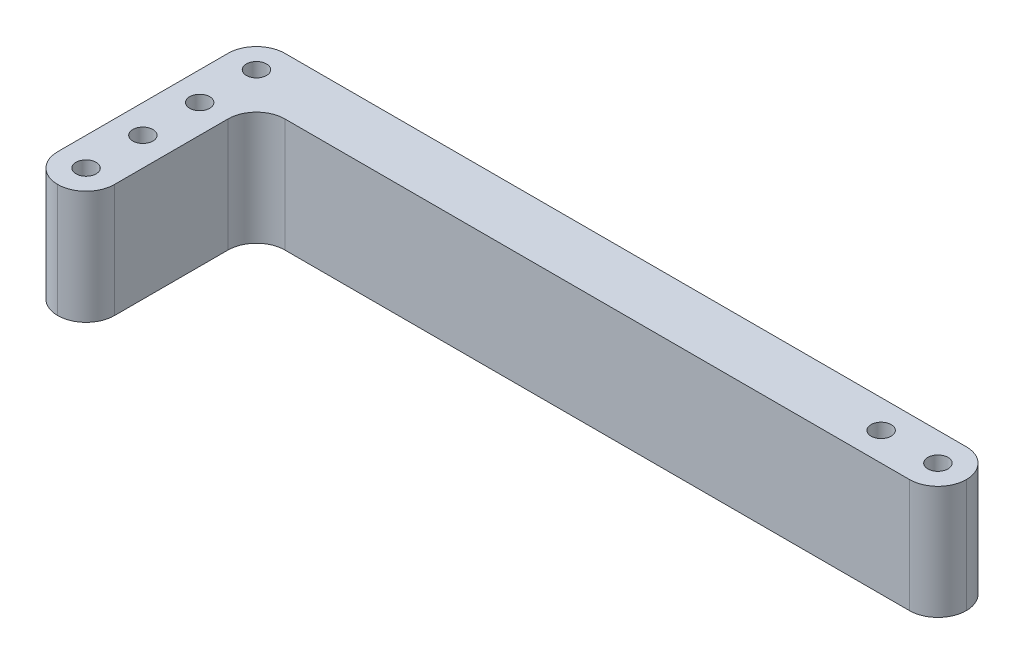
ISO-10303-21;
HEADER;
FILE_DESCRIPTION(('STEP AP214'),'2;1');
FILE_NAME('part.step','',(''),(''),'','','');
FILE_SCHEMA(('AUTOMOTIVE_DESIGN { 1 0 10303 214 1 1 1 1 }'));
ENDSEC;
DATA;
#1=APPLICATION_CONTEXT('core data for automotive mechanical design processes');
#2=APPLICATION_PROTOCOL_DEFINITION('international standard','automotive_design',2000,#1);
#3=PRODUCT_CONTEXT('',#1,'mechanical');
#4=PRODUCT('Part','Part','',(#3));
#5=PRODUCT_RELATED_PRODUCT_CATEGORY('part','',(#4));
#6=PRODUCT_DEFINITION_FORMATION('','',#4);
#7=PRODUCT_DEFINITION_CONTEXT('part definition',#1,'design');
#8=PRODUCT_DEFINITION('design','',#6,#7);
#9=PRODUCT_DEFINITION_SHAPE('','',#8);
#10=(LENGTH_UNIT() NAMED_UNIT(*) SI_UNIT(.MILLI.,.METRE.));
#11=(NAMED_UNIT(*) PLANE_ANGLE_UNIT() SI_UNIT($,.RADIAN.));
#12=(NAMED_UNIT(*) SI_UNIT($,.STERADIAN.) SOLID_ANGLE_UNIT());
#13=UNCERTAINTY_MEASURE_WITH_UNIT(LENGTH_MEASURE(1.E-05),#10,'distance_accuracy_value','');
#14=(GEOMETRIC_REPRESENTATION_CONTEXT(3) GLOBAL_UNCERTAINTY_ASSIGNED_CONTEXT((#13)) GLOBAL_UNIT_ASSIGNED_CONTEXT((#10,
#11,#12)) REPRESENTATION_CONTEXT('',''));
#15=CARTESIAN_POINT('',(0.,0.,0.));
#16=DIRECTION('',(0.,0.,1.));
#17=DIRECTION('',(1.,0.,0.));
#18=AXIS2_PLACEMENT_3D('',#15,#16,#17);
#19=CARTESIAN_POINT('',(0.,25.4,0.));
#20=DIRECTION('',(0.,-1.,0.));
#21=DIRECTION('',(0.,0.,-1.));
#22=AXIS2_PLACEMENT_3D('',#19,#20,#21);
#23=PLANE('',#22);
#24=DIRECTION('',(-1.,0.,0.));
#25=VECTOR('',#24,1.);
#26=CARTESIAN_POINT('',(-19.05,25.4,-44.45));
#27=LINE('',#26,#25);
#28=CARTESIAN_POINT('',(152.4,25.4,-44.45));
#29=VERTEX_POINT('',#28);
#30=CARTESIAN_POINT('',(0.,25.4,-44.45));
#31=VERTEX_POINT('',#30);
#32=EDGE_CURVE('E185',#29,#31,#27,.T.);
#33=ORIENTED_EDGE('',*,*,#32,.T.);
#34=CARTESIAN_POINT('',(0.,25.4,-38.1));
#35=DIRECTION('',(0.,-1.,0.));
#36=DIRECTION('',(0.,0.,-1.));
#37=AXIS2_PLACEMENT_3D('',#34,#35,#36);
#38=CIRCLE('',#37,6.35);
#39=CARTESIAN_POINT('',(-6.35,25.4,-38.1));
#40=VERTEX_POINT('',#39);
#41=EDGE_CURVE('E225',#31,#40,#38,.F.);
#42=ORIENTED_EDGE('',*,*,#41,.T.);
#43=DIRECTION('',(0.,0.,1.));
#44=VECTOR('',#43,1.);
#45=CARTESIAN_POINT('',(-6.35,25.4,6.35));
#46=LINE('',#45,#44);
#47=CARTESIAN_POINT('',(-6.35,25.4,0.));
#48=VERTEX_POINT('',#47);
#49=EDGE_CURVE('E431',#40,#48,#46,.T.);
#50=ORIENTED_EDGE('',*,*,#49,.T.);
#51=CARTESIAN_POINT('',(0.,25.4,0.));
#52=DIRECTION('',(0.,-1.,0.));
#53=DIRECTION('',(0.,0.,-1.));
#54=AXIS2_PLACEMENT_3D('',#51,#52,#53);
#55=CIRCLE('',#54,6.35);
#56=CARTESIAN_POINT('',(0.,25.4,6.35));
#57=VERTEX_POINT('',#56);
#58=EDGE_CURVE('E213',#48,#57,#55,.F.);
#59=ORIENTED_EDGE('',*,*,#58,.T.);
#60=CARTESIAN_POINT('',(0.,25.4,0.));
#61=DIRECTION('',(0.,-1.,0.));
#62=DIRECTION('',(0.,0.,-1.));
#63=AXIS2_PLACEMENT_3D('',#60,#61,#62);
#64=CIRCLE('',#63,6.35);
#65=CARTESIAN_POINT('',(6.35,25.4,0.));
#66=VERTEX_POINT('',#65);
#67=EDGE_CURVE('E216',#57,#66,#64,.F.);
#68=ORIENTED_EDGE('',*,*,#67,.T.);
#69=DIRECTION('',(0.,0.,-1.));
#70=VECTOR('',#69,1.);
#71=CARTESIAN_POINT('',(6.34999999999999,25.4,-31.75));
#72=LINE('',#71,#70);
#73=CARTESIAN_POINT('',(6.35,25.4,-25.4));
#74=VERTEX_POINT('',#73);
#75=EDGE_CURVE('E435',#66,#74,#72,.T.);
#76=ORIENTED_EDGE('',*,*,#75,.T.);
#77=CARTESIAN_POINT('',(12.7,25.4,-25.4));
#78=DIRECTION('',(0.,-1.,0.));
#79=DIRECTION('',(0.,0.,-1.));
#80=AXIS2_PLACEMENT_3D('',#77,#78,#79);
#81=CIRCLE('',#80,6.35);
#82=CARTESIAN_POINT('',(12.7,25.4,-31.75));
#83=VERTEX_POINT('',#82);
#84=EDGE_CURVE('E261',#74,#83,#81,.T.);
#85=ORIENTED_EDGE('',*,*,#84,.T.);
#86=DIRECTION('',(1.,0.,0.));
#87=VECTOR('',#86,1.);
#88=CARTESIAN_POINT('',(158.75,25.4,-31.75));
#89=LINE('',#88,#87);
#90=CARTESIAN_POINT('',(152.4,25.4,-31.75));
#91=VERTEX_POINT('',#90);
#92=EDGE_CURVE('E167',#83,#91,#89,.T.);
#93=ORIENTED_EDGE('',*,*,#92,.T.);
#94=CARTESIAN_POINT('',(152.4,25.4,-38.1));
#95=DIRECTION('',(0.,-1.,0.));
#96=DIRECTION('',(0.,0.,-1.));
#97=AXIS2_PLACEMENT_3D('',#94,#95,#96);
#98=CIRCLE('',#97,6.35);
#99=CARTESIAN_POINT('',(158.75,25.4,-38.1));
#100=VERTEX_POINT('',#99);
#101=EDGE_CURVE('E219',#91,#100,#98,.F.);
#102=ORIENTED_EDGE('',*,*,#101,.T.);
#103=CARTESIAN_POINT('',(152.4,25.4,-38.1));
#104=DIRECTION('',(0.,-1.,0.));
#105=DIRECTION('',(0.,0.,-1.));
#106=AXIS2_PLACEMENT_3D('',#103,#104,#105);
#107=CIRCLE('',#106,6.35);
#108=EDGE_CURVE('E222',#100,#29,#107,.F.);
#109=ORIENTED_EDGE('',*,*,#108,.T.);
#110=EDGE_LOOP('',(#33,#42,#50,#59,#68,#76,#85,#93,#102,#109));
#111=FACE_BOUND('',#110,.T.);
#112=CARTESIAN_POINT('',(0.,25.4,-38.1));
#113=DIRECTION('',(0.,1.,0.));
#114=DIRECTION('',(0.,0.,1.));
#115=AXIS2_PLACEMENT_3D('',#112,#113,#114);
#116=CIRCLE('',#115,2.25);
#117=CARTESIAN_POINT('',(0.,25.4,-35.85));
#118=VERTEX_POINT('',#117);
#119=EDGE_CURVE('E422',#118,#118,#116,.T.);
#120=ORIENTED_EDGE('',*,*,#119,.F.);
#121=EDGE_LOOP('',(#120));
#122=FACE_BOUND('',#121,.T.);
#123=CARTESIAN_POINT('',(152.4,25.4,-38.1));
#124=DIRECTION('',(0.,1.,0.));
#125=DIRECTION('',(0.,0.,1.));
#126=AXIS2_PLACEMENT_3D('',#123,#124,#125);
#127=CIRCLE('',#126,2.25000000000001);
#128=CARTESIAN_POINT('',(152.4,25.4,-35.85));
#129=VERTEX_POINT('',#128);
#130=EDGE_CURVE('E414',#129,#129,#127,.T.);
#131=ORIENTED_EDGE('',*,*,#130,.F.);
#132=EDGE_LOOP('',(#131));
#133=FACE_BOUND('',#132,.T.);
#134=CARTESIAN_POINT('',(139.7,25.4,-38.1));
#135=DIRECTION('',(0.,1.,0.));
#136=DIRECTION('',(0.,0.,1.));
#137=AXIS2_PLACEMENT_3D('',#134,#135,#136);
#138=CIRCLE('',#137,2.25000000000001);
#139=CARTESIAN_POINT('',(139.7,25.4,-35.85));
#140=VERTEX_POINT('',#139);
#141=EDGE_CURVE('E406',#140,#140,#138,.T.);
#142=ORIENTED_EDGE('',*,*,#141,.F.);
#143=EDGE_LOOP('',(#142));
#144=FACE_BOUND('',#143,.T.);
#145=CARTESIAN_POINT('',(1.32247788292465E-13,25.4,-25.4));
#146=DIRECTION('',(0.,1.,0.));
#147=DIRECTION('',(0.,0.,1.));
#148=AXIS2_PLACEMENT_3D('',#145,#146,#147);
#149=CIRCLE('',#148,2.25);
#150=CARTESIAN_POINT('',(1.32247788292465E-13,25.4,-23.15));
#151=VERTEX_POINT('',#150);
#152=EDGE_CURVE('E398',#151,#151,#149,.T.);
#153=ORIENTED_EDGE('',*,*,#152,.F.);
#154=EDGE_LOOP('',(#153));
#155=FACE_BOUND('',#154,.T.);
#156=CARTESIAN_POINT('',(2.6449557658493E-13,25.4,-12.7));
#157=DIRECTION('',(0.,1.,0.));
#158=DIRECTION('',(0.,0.,1.));
#159=AXIS2_PLACEMENT_3D('',#156,#157,#158);
#160=CIRCLE('',#159,2.25);
#161=CARTESIAN_POINT('',(2.6449557658493E-13,25.4,-10.45));
#162=VERTEX_POINT('',#161);
#163=EDGE_CURVE('E390',#162,#162,#160,.T.);
#164=ORIENTED_EDGE('',*,*,#163,.F.);
#165=EDGE_LOOP('',(#164));
#166=FACE_BOUND('',#165,.T.);
#167=CARTESIAN_POINT('',(3.96743364877394E-13,25.4,0.));
#168=DIRECTION('',(0.,1.,0.));
#169=DIRECTION('',(0.,0.,1.));
#170=AXIS2_PLACEMENT_3D('',#167,#168,#169);
#171=CIRCLE('',#170,2.25);
#172=CARTESIAN_POINT('',(3.96743364877394E-13,25.4,2.24999999999999));
#173=VERTEX_POINT('',#172);
#174=EDGE_CURVE('E382',#173,#173,#171,.T.);
#175=ORIENTED_EDGE('',*,*,#174,.F.);
#176=EDGE_LOOP('',(#175));
#177=FACE_BOUND('',#176,.T.);
#178=ADVANCED_FACE('F41',(#111,#122,#133,#144,#155,#166,#177),#23,.F.);
#179=CARTESIAN_POINT('',(0.,0.,0.));
#180=DIRECTION('',(0.,-1.,0.));
#181=DIRECTION('',(0.,0.,-1.));
#182=AXIS2_PLACEMENT_3D('',#179,#180,#181);
#183=PLANE('',#182);
#184=CARTESIAN_POINT('',(2.6449557658493E-13,0.,-12.7));
#185=DIRECTION('',(0.,1.,0.));
#186=DIRECTION('',(0.,0.,1.));
#187=AXIS2_PLACEMENT_3D('',#184,#185,#186);
#188=CIRCLE('',#187,2.25);
#189=CARTESIAN_POINT('',(2.6449557658493E-13,0.,-10.45));
#190=VERTEX_POINT('',#189);
#191=EDGE_CURVE('E386',#190,#190,#188,.T.);
#192=ORIENTED_EDGE('',*,*,#191,.T.);
#193=EDGE_LOOP('',(#192));
#194=FACE_BOUND('',#193,.T.);
#195=CARTESIAN_POINT('',(139.7,0.,-38.1));
#196=DIRECTION('',(0.,1.,0.));
#197=DIRECTION('',(0.,0.,1.));
#198=AXIS2_PLACEMENT_3D('',#195,#196,#197);
#199=CIRCLE('',#198,2.25000000000001);
#200=CARTESIAN_POINT('',(139.7,0.,-35.85));
#201=VERTEX_POINT('',#200);
#202=EDGE_CURVE('E402',#201,#201,#199,.T.);
#203=ORIENTED_EDGE('',*,*,#202,.T.);
#204=EDGE_LOOP('',(#203));
#205=FACE_BOUND('',#204,.T.);
#206=CARTESIAN_POINT('',(0.,0.,-38.1));
#207=DIRECTION('',(0.,1.,0.));
#208=DIRECTION('',(0.,0.,1.));
#209=AXIS2_PLACEMENT_3D('',#206,#207,#208);
#210=CIRCLE('',#209,2.25);
#211=CARTESIAN_POINT('',(0.,0.,-35.85));
#212=VERTEX_POINT('',#211);
#213=EDGE_CURVE('E418',#212,#212,#210,.T.);
#214=ORIENTED_EDGE('',*,*,#213,.T.);
#215=EDGE_LOOP('',(#214));
#216=FACE_BOUND('',#215,.T.);
#217=DIRECTION('',(-1.,0.,0.));
#218=VECTOR('',#217,1.);
#219=CARTESIAN_POINT('',(-19.05,0.,-44.45));
#220=LINE('',#219,#218);
#221=CARTESIAN_POINT('',(152.4,0.,-44.45));
#222=VERTEX_POINT('',#221);
#223=CARTESIAN_POINT('',(-12.7,0.,-44.45));
#224=VERTEX_POINT('',#223);
#225=EDGE_CURVE('E155',#222,#224,#220,.T.);
#226=ORIENTED_EDGE('',*,*,#225,.F.);
#227=CARTESIAN_POINT('',(152.4,0.,-38.1));
#228=DIRECTION('',(0.,-1.,0.));
#229=DIRECTION('',(0.,0.,-1.));
#230=AXIS2_PLACEMENT_3D('',#227,#228,#229);
#231=CIRCLE('',#230,6.35);
#232=CARTESIAN_POINT('',(158.75,0.,-38.1));
#233=VERTEX_POINT('',#232);
#234=EDGE_CURVE('E255',#222,#233,#231,.T.);
#235=ORIENTED_EDGE('',*,*,#234,.T.);
#236=CARTESIAN_POINT('',(152.4,0.,-38.1));
#237=DIRECTION('',(0.,-1.,0.));
#238=DIRECTION('',(0.,0.,-1.));
#239=AXIS2_PLACEMENT_3D('',#236,#237,#238);
#240=CIRCLE('',#239,6.35);
#241=CARTESIAN_POINT('',(152.4,0.,-31.75));
#242=VERTEX_POINT('',#241);
#243=EDGE_CURVE('E252',#233,#242,#240,.T.);
#244=ORIENTED_EDGE('',*,*,#243,.T.);
#245=DIRECTION('',(1.,0.,0.));
#246=VECTOR('',#245,1.);
#247=CARTESIAN_POINT('',(158.75,0.,-31.75));
#248=LINE('',#247,#246);
#249=CARTESIAN_POINT('',(12.7,0.,-31.75));
#250=VERTEX_POINT('',#249);
#251=EDGE_CURVE('E179',#250,#242,#248,.T.);
#252=ORIENTED_EDGE('',*,*,#251,.F.);
#253=CARTESIAN_POINT('',(12.7,0.,-25.4));
#254=DIRECTION('',(0.,-1.,0.));
#255=DIRECTION('',(0.,0.,-1.));
#256=AXIS2_PLACEMENT_3D('',#253,#254,#255);
#257=CIRCLE('',#256,6.35);
#258=CARTESIAN_POINT('',(6.35,0.,-25.4));
#259=VERTEX_POINT('',#258);
#260=EDGE_CURVE('E258',#250,#259,#257,.F.);
#261=ORIENTED_EDGE('',*,*,#260,.T.);
#262=DIRECTION('',(0.,0.,-1.));
#263=VECTOR('',#262,1.);
#264=CARTESIAN_POINT('',(6.34999999999999,0.,-31.75));
#265=LINE('',#264,#263);
#266=CARTESIAN_POINT('',(6.35,0.,0.));
#267=VERTEX_POINT('',#266);
#268=EDGE_CURVE('E175',#267,#259,#265,.T.);
#269=ORIENTED_EDGE('',*,*,#268,.F.);
#270=CARTESIAN_POINT('',(0.,0.,0.));
#271=DIRECTION('',(0.,-1.,0.));
#272=DIRECTION('',(0.,0.,-1.));
#273=AXIS2_PLACEMENT_3D('',#270,#271,#272);
#274=CIRCLE('',#273,6.35);
#275=CARTESIAN_POINT('',(0.,0.,6.35));
#276=VERTEX_POINT('',#275);
#277=EDGE_CURVE('E249',#267,#276,#274,.T.);
#278=ORIENTED_EDGE('',*,*,#277,.T.);
#279=CARTESIAN_POINT('',(0.,0.,0.));
#280=DIRECTION('',(0.,-1.,0.));
#281=DIRECTION('',(0.,0.,-1.));
#282=AXIS2_PLACEMENT_3D('',#279,#280,#281);
#283=CIRCLE('',#282,6.35);
#284=CARTESIAN_POINT('',(-6.35,0.,0.));
#285=VERTEX_POINT('',#284);
#286=EDGE_CURVE('E173',#276,#285,#283,.T.);
#287=ORIENTED_EDGE('',*,*,#286,.T.);
#288=DIRECTION('',(0.,0.,1.));
#289=VECTOR('',#288,1.);
#290=CARTESIAN_POINT('',(-6.35,0.,6.35));
#291=LINE('',#290,#289);
#292=CARTESIAN_POINT('',(-6.35,0.,-31.75));
#293=VERTEX_POINT('',#292);
#294=EDGE_CURVE('E154',#293,#285,#291,.T.);
#295=ORIENTED_EDGE('',*,*,#294,.F.);
#296=DIRECTION('',(1.,0.,0.));
#297=VECTOR('',#296,1.);
#298=CARTESIAN_POINT('',(-6.35,0.,-31.75));
#299=LINE('',#298,#297);
#300=CARTESIAN_POINT('',(-12.7,0.,-31.75));
#301=VERTEX_POINT('',#300);
#302=EDGE_CURVE('E146',#301,#293,#299,.T.);
#303=ORIENTED_EDGE('',*,*,#302,.F.);
#304=DIRECTION('',(0.,0.,1.));
#305=VECTOR('',#304,1.);
#306=CARTESIAN_POINT('',(-12.7,0.,-44.45));
#307=LINE('',#306,#305);
#308=EDGE_CURVE('E244',#301,#224,#307,.F.);
#309=ORIENTED_EDGE('',*,*,#308,.T.);
#310=EDGE_LOOP('',(#226,#235,#244,#252,#261,#269,#278,#287,#295,#303,#309));
#311=FACE_BOUND('',#310,.T.);
#312=CARTESIAN_POINT('',(152.4,0.,-38.1));
#313=DIRECTION('',(0.,1.,0.));
#314=DIRECTION('',(0.,0.,1.));
#315=AXIS2_PLACEMENT_3D('',#312,#313,#314);
#316=CIRCLE('',#315,2.25000000000001);
#317=CARTESIAN_POINT('',(152.4,0.,-35.85));
#318=VERTEX_POINT('',#317);
#319=EDGE_CURVE('E410',#318,#318,#316,.T.);
#320=ORIENTED_EDGE('',*,*,#319,.T.);
#321=EDGE_LOOP('',(#320));
#322=FACE_BOUND('',#321,.T.);
#323=CARTESIAN_POINT('',(1.32247788292465E-13,0.,-25.4));
#324=DIRECTION('',(0.,1.,0.));
#325=DIRECTION('',(0.,0.,1.));
#326=AXIS2_PLACEMENT_3D('',#323,#324,#325);
#327=CIRCLE('',#326,2.25);
#328=CARTESIAN_POINT('',(1.32247788292465E-13,0.,-23.15));
#329=VERTEX_POINT('',#328);
#330=EDGE_CURVE('E394',#329,#329,#327,.T.);
#331=ORIENTED_EDGE('',*,*,#330,.T.);
#332=EDGE_LOOP('',(#331));
#333=FACE_BOUND('',#332,.T.);
#334=CARTESIAN_POINT('',(3.96743364877394E-13,0.,0.));
#335=DIRECTION('',(0.,1.,0.));
#336=DIRECTION('',(0.,0.,1.));
#337=AXIS2_PLACEMENT_3D('',#334,#335,#336);
#338=CIRCLE('',#337,2.25);
#339=CARTESIAN_POINT('',(3.96743364877394E-13,0.,2.24999999999999));
#340=VERTEX_POINT('',#339);
#341=EDGE_CURVE('E378',#340,#340,#338,.T.);
#342=ORIENTED_EDGE('',*,*,#341,.T.);
#343=EDGE_LOOP('',(#342));
#344=FACE_BOUND('',#343,.T.);
#345=ADVANCED_FACE('F170',(#194,#205,#216,#311,#322,#333,#344),#183,.T.);
#346=CARTESIAN_POINT('',(-19.05,25.4,-44.45));
#347=DIRECTION('',(0.,0.,1.));
#348=DIRECTION('',(1.,0.,0.));
#349=AXIS2_PLACEMENT_3D('',#346,#347,#348);
#350=PLANE('',#349);
#351=CARTESIAN_POINT('',(-12.7,6.35,-44.45));
#352=DIRECTION('',(0.,0.,1.));
#353=DIRECTION('',(1.,0.,0.));
#354=AXIS2_PLACEMENT_3D('',#351,#352,#353);
#355=CIRCLE('',#354,2.25);
#356=CARTESIAN_POINT('',(-10.45,6.35,-44.45));
#357=VERTEX_POINT('',#356);
#358=EDGE_CURVE('E373',#357,#357,#355,.T.);
#359=ORIENTED_EDGE('',*,*,#358,.T.);
#360=EDGE_LOOP('',(#359));
#361=FACE_BOUND('',#360,.T.);
#362=DIRECTION('',(1.,0.,0.));
#363=VECTOR('',#362,1.);
#364=CARTESIAN_POINT('',(-19.05,12.7,-44.45));
#365=LINE('',#364,#363);
#366=CARTESIAN_POINT('',(-12.7,12.7,-44.45));
#367=VERTEX_POINT('',#366);
#368=CARTESIAN_POINT('',(-10.9985226280624,12.7,-44.45));
#369=VERTEX_POINT('',#368);
#370=EDGE_CURVE('E269',#367,#369,#365,.T.);
#371=ORIENTED_EDGE('',*,*,#370,.T.);
#372=CARTESIAN_POINT('',(-10.9985226280624,12.7,-44.45));
#373=CARTESIAN_POINT('',(-10.7264399605844,12.6999622853966,-44.45));
#374=CARTESIAN_POINT('',(-10.454516183728,12.7131093478432,-44.45));
#375=CARTESIAN_POINT('',(-9.91336878460618,12.7639670137249,-44.45));
#376=CARTESIAN_POINT('',(-9.64414168532752,12.8016402366621,-44.45));
#377=CARTESIAN_POINT('',(-9.11314851856229,12.899163881017,-44.45));
#378=CARTESIAN_POINT('',(-8.85133164071495,12.9587416591887,-44.45));
#379=CARTESIAN_POINT('',(-8.33310121119398,13.0982686668657,-44.45));
#380=CARTESIAN_POINT('',(-8.07669030408583,13.1782276273355,-44.45));
#381=CARTESIAN_POINT('',(-7.47619040964586,13.3897882617761,-44.45));
#382=CARTESIAN_POINT('',(-7.1349627112763,13.5295364128919,-44.45));
#383=CARTESIAN_POINT('',(-6.46633087999087,13.8387917029893,-44.45));
#384=CARTESIAN_POINT('',(-6.13893097438962,14.0083078618634,-44.45));
#385=CARTESIAN_POINT('',(-5.49687086553149,14.3731283825832,-44.45));
#386=CARTESIAN_POINT('',(-5.18227896501696,14.568552026769,-44.45));
#387=CARTESIAN_POINT('',(-4.56680800886042,14.98004686804,-44.45));
#388=CARTESIAN_POINT('',(-4.26593531465939,15.196127502593,-44.45));
#389=CARTESIAN_POINT('',(-3.25919104813585,15.9624628646344,-44.45));
#390=CARTESIAN_POINT('',(-2.58371262956308,16.5522784171673,-44.45));
#391=CARTESIAN_POINT('',(-1.27591428163255,17.7742833799196,-44.45));
#392=CARTESIAN_POINT('',(-0.643561438869836,18.4064397284406,-44.45));
#393=CARTESIAN_POINT('',(-0.00751295407418873,19.0424870479163,-44.45));
#394=CARTESIAN_POINT('',(-0.00375647818969396,19.0462435238131,-44.45));
#395=CARTESIAN_POINT('',(0.,19.05,-44.45));
#396=B_SPLINE_CURVE_WITH_KNOTS('',3,(#372,#373,#374,#375,#376,#377,#378,#379,#380,#381,#382,
#383,#384,#385,#386,#387,#388,#389,#390,#391,#392,#393,#394,#395),.UNSPECIFIED.,.F.,.F.,(4,2,2,
2,2,2,2,2,2,2,2,4),(0.,0.815697815688468,1.63015532177637,2.43480081085317,3.23983119865842,
4.34428890384835,5.44908184589931,6.55915057401004,7.66972890030429,10.3543875698813,
13.0369738343204,13.0529112117709),.UNSPECIFIED.);
#397=CARTESIAN_POINT('',(0.,19.05,-44.45));
#398=VERTEX_POINT('',#397);
#399=EDGE_CURVE('E51',#369,#398,#396,.T.);
#400=ORIENTED_EDGE('',*,*,#399,.T.);
#401=DIRECTION('',(0.,1.,0.));
#402=VECTOR('',#401,1.);
#403=CARTESIAN_POINT('',(0.,25.4,-44.45));
#404=LINE('',#403,#402);
#405=EDGE_CURVE('E210',#398,#31,#404,.T.);
#406=ORIENTED_EDGE('',*,*,#405,.T.);
#407=ORIENTED_EDGE('',*,*,#32,.F.);
#408=DIRECTION('',(0.,-1.,0.));
#409=VECTOR('',#408,1.);
#410=CARTESIAN_POINT('',(152.4,25.4,-44.45));
#411=LINE('',#410,#409);
#412=EDGE_CURVE('E206',#29,#222,#411,.T.);
#413=ORIENTED_EDGE('',*,*,#412,.T.);
#414=ORIENTED_EDGE('',*,*,#225,.T.);
#415=CARTESIAN_POINT('',(-12.7,6.35,-44.45));
#416=DIRECTION('',(0.,0.,1.));
#417=DIRECTION('',(1.,0.,0.));
#418=AXIS2_PLACEMENT_3D('',#415,#416,#417);
#419=CIRCLE('',#418,6.35);
#420=CARTESIAN_POINT('',(-19.05,6.35,-44.45));
#421=VERTEX_POINT('',#420);
#422=EDGE_CURVE('E200',#224,#421,#419,.F.);
#423=ORIENTED_EDGE('',*,*,#422,.T.);
#424=CARTESIAN_POINT('',(-12.7,6.35,-44.45));
#425=DIRECTION('',(0.,0.,1.));
#426=DIRECTION('',(1.,0.,0.));
#427=AXIS2_PLACEMENT_3D('',#424,#425,#426);
#428=CIRCLE('',#427,6.35);
#429=EDGE_CURVE('E203',#421,#367,#428,.F.);
#430=ORIENTED_EDGE('',*,*,#429,.T.);
#431=EDGE_LOOP('',(#371,#400,#406,#407,#413,#414,#423,#430));
#432=FACE_BOUND('',#431,.T.);
#433=ADVANCED_FACE('F292',(#361,#432),#350,.F.);
#434=CARTESIAN_POINT('',(-6.35,25.4,-31.75));
#435=DIRECTION('',(0.,0.,-1.));
#436=DIRECTION('',(-1.,0.,0.));
#437=AXIS2_PLACEMENT_3D('',#434,#435,#436);
#438=PLANE('',#437);
#439=CARTESIAN_POINT('',(-12.7,6.35,-31.75));
#440=DIRECTION('',(0.,0.,1.));
#441=DIRECTION('',(1.,0.,0.));
#442=AXIS2_PLACEMENT_3D('',#439,#440,#441);
#443=CIRCLE('',#442,2.25);
#444=CARTESIAN_POINT('',(-10.45,6.35,-31.75));
#445=VERTEX_POINT('',#444);
#446=EDGE_CURVE('E370',#445,#445,#443,.T.);
#447=ORIENTED_EDGE('',*,*,#446,.F.);
#448=EDGE_LOOP('',(#447));
#449=FACE_BOUND('',#448,.T.);
#450=DIRECTION('',(0.,-1.,0.));
#451=VECTOR('',#450,1.);
#452=CARTESIAN_POINT('',(-6.35,25.4,-31.75));
#453=LINE('',#452,#451);
#454=CARTESIAN_POINT('',(-6.35,19.05,-31.75));
#455=VERTEX_POINT('',#454);
#456=EDGE_CURVE('E57',#455,#293,#453,.T.);
#457=ORIENTED_EDGE('',*,*,#456,.F.);
#458=CARTESIAN_POINT('',(-12.7,19.05,-31.75));
#459=DIRECTION('',(0.,0.,-1.));
#460=DIRECTION('',(-1.,0.,0.));
#461=AXIS2_PLACEMENT_3D('',#458,#459,#460);
#462=CIRCLE('',#461,6.35);
#463=CARTESIAN_POINT('',(-12.7,12.7,-31.75));
#464=VERTEX_POINT('',#463);
#465=EDGE_CURVE('E11',#455,#464,#462,.T.);
#466=ORIENTED_EDGE('',*,*,#465,.T.);
#467=CARTESIAN_POINT('',(-12.7,6.35,-31.75));
#468=DIRECTION('',(0.,0.,-1.));
#469=DIRECTION('',(-1.,0.,0.));
#470=AXIS2_PLACEMENT_3D('',#467,#468,#469);
#471=CIRCLE('',#470,6.35);
#472=CARTESIAN_POINT('',(-19.05,6.35,-31.75));
#473=VERTEX_POINT('',#472);
#474=EDGE_CURVE('E241',#464,#473,#471,.F.);
#475=ORIENTED_EDGE('',*,*,#474,.T.);
#476=CARTESIAN_POINT('',(-12.7,6.35,-31.75));
#477=DIRECTION('',(0.,0.,-1.));
#478=DIRECTION('',(-1.,0.,0.));
#479=AXIS2_PLACEMENT_3D('',#476,#477,#478);
#480=CIRCLE('',#479,6.35);
#481=EDGE_CURVE('E149',#473,#301,#480,.F.);
#482=ORIENTED_EDGE('',*,*,#481,.T.);
#483=ORIENTED_EDGE('',*,*,#302,.T.);
#484=EDGE_LOOP('',(#457,#466,#475,#482,#483));
#485=FACE_BOUND('',#484,.T.);
#486=ADVANCED_FACE('F147',(#449,#485),#438,.F.);
#487=CARTESIAN_POINT('',(-6.35,25.4,6.35));
#488=DIRECTION('',(1.,0.,0.));
#489=DIRECTION('',(0.,0.,-1.));
#490=AXIS2_PLACEMENT_3D('',#487,#488,#489);
#491=PLANE('',#490);
#492=DIRECTION('',(0.,1.,0.));
#493=VECTOR('',#492,1.);
#494=CARTESIAN_POINT('',(-6.35,25.4,-38.1));
#495=LINE('',#494,#493);
#496=CARTESIAN_POINT('',(-6.35,19.05,-38.1));
#497=VERTEX_POINT('',#496);
#498=EDGE_CURVE('E231',#40,#497,#495,.F.);
#499=ORIENTED_EDGE('',*,*,#498,.T.);
#500=DIRECTION('',(0.,0.,1.));
#501=VECTOR('',#500,1.);
#502=CARTESIAN_POINT('',(-6.35,19.05,-31.75));
#503=LINE('',#502,#501);
#504=EDGE_CURVE('E163',#497,#455,#503,.T.);
#505=ORIENTED_EDGE('',*,*,#504,.T.);
#506=ORIENTED_EDGE('',*,*,#456,.T.);
#507=ORIENTED_EDGE('',*,*,#294,.T.);
#508=DIRECTION('',(0.,-1.,0.));
#509=VECTOR('',#508,1.);
#510=CARTESIAN_POINT('',(-6.35,25.4,0.));
#511=LINE('',#510,#509);
#512=EDGE_CURVE('E228',#285,#48,#511,.F.);
#513=ORIENTED_EDGE('',*,*,#512,.T.);
#514=ORIENTED_EDGE('',*,*,#49,.F.);
#515=EDGE_LOOP('',(#499,#505,#506,#507,#513,#514));
#516=FACE_BOUND('',#515,.T.);
#517=ADVANCED_FACE('F160',(#516),#491,.F.);
#518=CARTESIAN_POINT('',(6.34999999999999,25.4,-31.75));
#519=DIRECTION('',(-1.,0.,0.));
#520=DIRECTION('',(0.,0.,1.));
#521=AXIS2_PLACEMENT_3D('',#518,#519,#520);
#522=PLANE('',#521);
#523=ORIENTED_EDGE('',*,*,#268,.T.);
#524=DIRECTION('',(0.,-1.,0.));
#525=VECTOR('',#524,1.);
#526=CARTESIAN_POINT('',(6.35,25.4,-25.4));
#527=LINE('',#526,#525);
#528=EDGE_CURVE('E197',#259,#74,#527,.F.);
#529=ORIENTED_EDGE('',*,*,#528,.T.);
#530=ORIENTED_EDGE('',*,*,#75,.F.);
#531=DIRECTION('',(0.,-1.,0.));
#532=VECTOR('',#531,1.);
#533=CARTESIAN_POINT('',(6.35,25.4,0.));
#534=LINE('',#533,#532);
#535=EDGE_CURVE('E193',#66,#267,#534,.T.);
#536=ORIENTED_EDGE('',*,*,#535,.T.);
#537=EDGE_LOOP('',(#523,#529,#530,#536));
#538=FACE_BOUND('',#537,.T.);
#539=ADVANCED_FACE('F356',(#538),#522,.F.);
#540=CARTESIAN_POINT('',(158.75,25.4,-31.75));
#541=DIRECTION('',(0.,0.,-1.));
#542=DIRECTION('',(-1.,0.,0.));
#543=AXIS2_PLACEMENT_3D('',#540,#541,#542);
#544=PLANE('',#543);
#545=ORIENTED_EDGE('',*,*,#92,.F.);
#546=DIRECTION('',(0.,-1.,0.));
#547=VECTOR('',#546,1.);
#548=CARTESIAN_POINT('',(12.7,0.,-31.75));
#549=LINE('',#548,#547);
#550=EDGE_CURVE('E189',#83,#250,#549,.T.);
#551=ORIENTED_EDGE('',*,*,#550,.T.);
#552=ORIENTED_EDGE('',*,*,#251,.T.);
#553=DIRECTION('',(0.,-1.,0.));
#554=VECTOR('',#553,1.);
#555=CARTESIAN_POINT('',(152.4,25.4,-31.75));
#556=LINE('',#555,#554);
#557=EDGE_CURVE('E166',#242,#91,#556,.F.);
#558=ORIENTED_EDGE('',*,*,#557,.T.);
#559=EDGE_LOOP('',(#545,#551,#552,#558));
#560=FACE_BOUND('',#559,.T.);
#561=ADVANCED_FACE('F353',(#560),#544,.F.);
#562=CARTESIAN_POINT('',(0.,25.4,-38.1));
#563=DIRECTION('',(0.,-1.,0.));
#564=DIRECTION('',(0.,0.,-1.));
#565=AXIS2_PLACEMENT_3D('',#562,#563,#564);
#566=CYLINDRICAL_SURFACE('',#565,2.25);
#567=ORIENTED_EDGE('',*,*,#119,.T.);
#568=EDGE_LOOP('',(#567));
#569=FACE_BOUND('',#568,.T.);
#570=ORIENTED_EDGE('',*,*,#213,.F.);
#571=EDGE_LOOP('',(#570));
#572=FACE_BOUND('',#571,.T.);
#573=ADVANCED_FACE('F350',(#569,#572),#566,.F.);
#574=CARTESIAN_POINT('',(152.4,25.4,-38.1));
#575=DIRECTION('',(0.,-1.,0.));
#576=DIRECTION('',(0.,0.,-1.));
#577=AXIS2_PLACEMENT_3D('',#574,#575,#576);
#578=CYLINDRICAL_SURFACE('',#577,2.25000000000001);
#579=ORIENTED_EDGE('',*,*,#130,.T.);
#580=EDGE_LOOP('',(#579));
#581=FACE_BOUND('',#580,.T.);
#582=ORIENTED_EDGE('',*,*,#319,.F.);
#583=EDGE_LOOP('',(#582));
#584=FACE_BOUND('',#583,.T.);
#585=ADVANCED_FACE('F576',(#581,#584),#578,.F.);
#586=CARTESIAN_POINT('',(139.7,25.4,-38.1));
#587=DIRECTION('',(0.,-1.,0.));
#588=DIRECTION('',(0.,0.,-1.));
#589=AXIS2_PLACEMENT_3D('',#586,#587,#588);
#590=CYLINDRICAL_SURFACE('',#589,2.25000000000001);
#591=ORIENTED_EDGE('',*,*,#141,.T.);
#592=EDGE_LOOP('',(#591));
#593=FACE_BOUND('',#592,.T.);
#594=ORIENTED_EDGE('',*,*,#202,.F.);
#595=EDGE_LOOP('',(#594));
#596=FACE_BOUND('',#595,.T.);
#597=ADVANCED_FACE('F567',(#593,#596),#590,.F.);
#598=CARTESIAN_POINT('',(1.32247788292465E-13,25.4,-25.4));
#599=DIRECTION('',(0.,-1.,0.));
#600=DIRECTION('',(0.,0.,-1.));
#601=AXIS2_PLACEMENT_3D('',#598,#599,#600);
#602=CYLINDRICAL_SURFACE('',#601,2.25);
#603=ORIENTED_EDGE('',*,*,#152,.T.);
#604=EDGE_LOOP('',(#603));
#605=FACE_BOUND('',#604,.T.);
#606=ORIENTED_EDGE('',*,*,#330,.F.);
#607=EDGE_LOOP('',(#606));
#608=FACE_BOUND('',#607,.T.);
#609=ADVANCED_FACE('F558',(#605,#608),#602,.F.);
#610=CARTESIAN_POINT('',(2.6449557658493E-13,25.4,-12.7));
#611=DIRECTION('',(0.,-1.,0.));
#612=DIRECTION('',(0.,0.,-1.));
#613=AXIS2_PLACEMENT_3D('',#610,#611,#612);
#614=CYLINDRICAL_SURFACE('',#613,2.25);
#615=ORIENTED_EDGE('',*,*,#163,.T.);
#616=EDGE_LOOP('',(#615));
#617=FACE_BOUND('',#616,.T.);
#618=ORIENTED_EDGE('',*,*,#191,.F.);
#619=EDGE_LOOP('',(#618));
#620=FACE_BOUND('',#619,.T.);
#621=ADVANCED_FACE('F549',(#617,#620),#614,.F.);
#622=CARTESIAN_POINT('',(3.96743364877394E-13,25.4,0.));
#623=DIRECTION('',(0.,-1.,0.));
#624=DIRECTION('',(0.,0.,-1.));
#625=AXIS2_PLACEMENT_3D('',#622,#623,#624);
#626=CYLINDRICAL_SURFACE('',#625,2.25);
#627=ORIENTED_EDGE('',*,*,#174,.T.);
#628=EDGE_LOOP('',(#627));
#629=FACE_BOUND('',#628,.T.);
#630=ORIENTED_EDGE('',*,*,#341,.F.);
#631=EDGE_LOOP('',(#630));
#632=FACE_BOUND('',#631,.T.);
#633=ADVANCED_FACE('F532',(#629,#632),#626,.F.);
#634=CARTESIAN_POINT('',(-19.05,12.7,-44.45));
#635=DIRECTION('',(0.,-1.,0.));
#636=DIRECTION('',(0.,0.,-1.));
#637=AXIS2_PLACEMENT_3D('',#634,#635,#636);
#638=PLANE('',#637);
#639=DIRECTION('',(0.,0.,1.));
#640=VECTOR('',#639,1.);
#641=CARTESIAN_POINT('',(-12.7,12.7,-44.45));
#642=LINE('',#641,#640);
#643=CARTESIAN_POINT('',(-12.7,12.7,-38.1));
#644=VERTEX_POINT('',#643);
#645=EDGE_CURVE('E235',#367,#644,#642,.T.);
#646=ORIENTED_EDGE('',*,*,#645,.T.);
#647=CARTESIAN_POINT('',(0.,12.7,-38.1));
#648=DIRECTION('',(0.,-1.,0.));
#649=DIRECTION('',(0.,0.,-1.));
#650=AXIS2_PLACEMENT_3D('',#647,#648,#649);
#651=CIRCLE('',#650,12.7);
#652=EDGE_CURVE('E264',#644,#369,#651,.T.);
#653=ORIENTED_EDGE('',*,*,#652,.T.);
#654=ORIENTED_EDGE('',*,*,#370,.F.);
#655=EDGE_LOOP('',(#646,#653,#654));
#656=FACE_BOUND('',#655,.T.);
#657=ADVANCED_FACE('F335',(#656),#638,.F.);
#658=CARTESIAN_POINT('',(-12.7,6.35,-44.45));
#659=DIRECTION('',(0.,0.,1.));
#660=DIRECTION('',(1.,0.,0.));
#661=AXIS2_PLACEMENT_3D('',#658,#659,#660);
#662=CYLINDRICAL_SURFACE('',#661,2.25);
#663=ORIENTED_EDGE('',*,*,#358,.F.);
#664=EDGE_LOOP('',(#663));
#665=FACE_BOUND('',#664,.T.);
#666=ORIENTED_EDGE('',*,*,#446,.T.);
#667=EDGE_LOOP('',(#666));
#668=FACE_BOUND('',#667,.T.);
#669=ADVANCED_FACE('F330',(#665,#668),#662,.F.);
#670=CARTESIAN_POINT('',(12.7,25.4,-25.4));
#671=DIRECTION('',(0.,1.,0.));
#672=DIRECTION('',(0.,0.,1.));
#673=AXIS2_PLACEMENT_3D('',#670,#671,#672);
#674=CYLINDRICAL_SURFACE('',#673,6.35);
#675=ORIENTED_EDGE('',*,*,#84,.F.);
#676=ORIENTED_EDGE('',*,*,#528,.F.);
#677=ORIENTED_EDGE('',*,*,#260,.F.);
#678=ORIENTED_EDGE('',*,*,#550,.F.);
#679=EDGE_LOOP('',(#675,#676,#677,#678));
#680=FACE_BOUND('',#679,.T.);
#681=ADVANCED_FACE('F327',(#680),#674,.F.);
#682=CARTESIAN_POINT('',(0.,25.4,-38.1));
#683=DIRECTION('',(0.,1.,0.));
#684=DIRECTION('',(0.,0.,1.));
#685=AXIS2_PLACEMENT_3D('',#682,#683,#684);
#686=CYLINDRICAL_SURFACE('',#685,6.35);
#687=ORIENTED_EDGE('',*,*,#405,.F.);
#688=CARTESIAN_POINT('',(0.,19.05,-38.1));
#689=DIRECTION('',(0.,-1.,0.));
#690=DIRECTION('',(0.,0.,-1.));
#691=AXIS2_PLACEMENT_3D('',#688,#689,#690);
#692=CIRCLE('',#691,6.35);
#693=EDGE_CURVE('E281',#398,#497,#692,.F.);
#694=ORIENTED_EDGE('',*,*,#693,.T.);
#695=ORIENTED_EDGE('',*,*,#498,.F.);
#696=ORIENTED_EDGE('',*,*,#41,.F.);
#697=EDGE_LOOP('',(#687,#694,#695,#696));
#698=FACE_BOUND('',#697,.T.);
#699=ADVANCED_FACE('F321',(#698),#686,.T.);
#700=CARTESIAN_POINT('',(-12.7,6.35,-31.75));
#701=DIRECTION('',(0.,0.,-1.));
#702=DIRECTION('',(-1.,0.,0.));
#703=AXIS2_PLACEMENT_3D('',#700,#701,#702);
#704=CYLINDRICAL_SURFACE('',#703,6.35);
#705=DIRECTION('',(0.,0.,1.));
#706=VECTOR('',#705,1.);
#707=CARTESIAN_POINT('',(-19.05,6.35,-31.75));
#708=LINE('',#707,#706);
#709=EDGE_CURVE('E265',#421,#473,#708,.T.);
#710=ORIENTED_EDGE('',*,*,#709,.F.);
#711=ORIENTED_EDGE('',*,*,#422,.F.);
#712=ORIENTED_EDGE('',*,*,#308,.F.);
#713=ORIENTED_EDGE('',*,*,#481,.F.);
#714=EDGE_LOOP('',(#710,#711,#712,#713));
#715=FACE_BOUND('',#714,.T.);
#716=ADVANCED_FACE('F318',(#715),#704,.T.);
#717=CARTESIAN_POINT('',(-12.7,6.35,-44.45));
#718=DIRECTION('',(0.,0.,1.));
#719=DIRECTION('',(1.,0.,0.));
#720=AXIS2_PLACEMENT_3D('',#717,#718,#719);
#721=CYLINDRICAL_SURFACE('',#720,6.35);
#722=ORIENTED_EDGE('',*,*,#429,.F.);
#723=ORIENTED_EDGE('',*,*,#709,.T.);
#724=ORIENTED_EDGE('',*,*,#474,.F.);
#725=EDGE_CURVE('E234',#644,#464,#642,.T.);
#726=ORIENTED_EDGE('',*,*,#725,.F.);
#727=ORIENTED_EDGE('',*,*,#645,.F.);
#728=EDGE_LOOP('',(#722,#723,#724,#726,#727));
#729=FACE_BOUND('',#728,.T.);
#730=ADVANCED_FACE('F313',(#729),#721,.T.);
#731=CARTESIAN_POINT('',(152.4,25.4,-38.1));
#732=DIRECTION('',(0.,-1.,0.));
#733=DIRECTION('',(0.,0.,-1.));
#734=AXIS2_PLACEMENT_3D('',#731,#732,#733);
#735=CYLINDRICAL_SURFACE('',#734,6.35);
#736=DIRECTION('',(0.,-1.,0.));
#737=VECTOR('',#736,1.);
#738=CARTESIAN_POINT('',(158.75,25.4,-38.1));
#739=LINE('',#738,#737);
#740=EDGE_CURVE('E270',#100,#233,#739,.T.);
#741=ORIENTED_EDGE('',*,*,#740,.F.);
#742=ORIENTED_EDGE('',*,*,#101,.F.);
#743=ORIENTED_EDGE('',*,*,#557,.F.);
#744=ORIENTED_EDGE('',*,*,#243,.F.);
#745=EDGE_LOOP('',(#741,#742,#743,#744));
#746=FACE_BOUND('',#745,.T.);
#747=ADVANCED_FACE('F310',(#746),#735,.T.);
#748=CARTESIAN_POINT('',(152.4,25.4,-38.1));
#749=DIRECTION('',(0.,-1.,0.));
#750=DIRECTION('',(0.,0.,-1.));
#751=AXIS2_PLACEMENT_3D('',#748,#749,#750);
#752=CYLINDRICAL_SURFACE('',#751,6.35);
#753=ORIENTED_EDGE('',*,*,#108,.F.);
#754=ORIENTED_EDGE('',*,*,#740,.T.);
#755=ORIENTED_EDGE('',*,*,#234,.F.);
#756=ORIENTED_EDGE('',*,*,#412,.F.);
#757=EDGE_LOOP('',(#753,#754,#755,#756));
#758=FACE_BOUND('',#757,.T.);
#759=ADVANCED_FACE('F305',(#758),#752,.T.);
#760=CARTESIAN_POINT('',(0.,25.4,0.));
#761=DIRECTION('',(0.,-1.,0.));
#762=DIRECTION('',(0.,0.,-1.));
#763=AXIS2_PLACEMENT_3D('',#760,#761,#762);
#764=CYLINDRICAL_SURFACE('',#763,6.35);
#765=DIRECTION('',(0.,-1.,0.));
#766=VECTOR('',#765,1.);
#767=CARTESIAN_POINT('',(0.,25.4,6.35));
#768=LINE('',#767,#766);
#769=EDGE_CURVE('E274',#57,#276,#768,.T.);
#770=ORIENTED_EDGE('',*,*,#769,.F.);
#771=ORIENTED_EDGE('',*,*,#58,.F.);
#772=ORIENTED_EDGE('',*,*,#512,.F.);
#773=ORIENTED_EDGE('',*,*,#286,.F.);
#774=EDGE_LOOP('',(#770,#771,#772,#773));
#775=FACE_BOUND('',#774,.T.);
#776=ADVANCED_FACE('F301',(#775),#764,.T.);
#777=CARTESIAN_POINT('',(0.,25.4,0.));
#778=DIRECTION('',(0.,-1.,0.));
#779=DIRECTION('',(0.,0.,-1.));
#780=AXIS2_PLACEMENT_3D('',#777,#778,#779);
#781=CYLINDRICAL_SURFACE('',#780,6.35);
#782=ORIENTED_EDGE('',*,*,#67,.F.);
#783=ORIENTED_EDGE('',*,*,#769,.T.);
#784=ORIENTED_EDGE('',*,*,#277,.F.);
#785=ORIENTED_EDGE('',*,*,#535,.F.);
#786=EDGE_LOOP('',(#782,#783,#784,#785));
#787=FACE_BOUND('',#786,.T.);
#788=ADVANCED_FACE('F304',(#787),#781,.T.);
#789=CARTESIAN_POINT('',(-12.7,19.05,6.35));
#790=DIRECTION('',(0.,0.,-1.));
#791=DIRECTION('',(-1.,0.,0.));
#792=AXIS2_PLACEMENT_3D('',#789,#790,#791);
#793=CYLINDRICAL_SURFACE('',#792,6.35);
#794=ORIENTED_EDGE('',*,*,#465,.F.);
#795=ORIENTED_EDGE('',*,*,#504,.F.);
#796=CARTESIAN_POINT('',(-12.7,19.05,-38.1));
#797=DIRECTION('',(0.,0.,1.));
#798=DIRECTION('',(1.,0.,0.));
#799=AXIS2_PLACEMENT_3D('',#796,#797,#798);
#800=CIRCLE('',#799,6.35);
#801=EDGE_CURVE('E45',#644,#497,#800,.T.);
#802=ORIENTED_EDGE('',*,*,#801,.F.);
#803=ORIENTED_EDGE('',*,*,#725,.T.);
#804=EDGE_LOOP('',(#794,#795,#802,#803));
#805=FACE_BOUND('',#804,.T.);
#806=ADVANCED_FACE('F43',(#805),#793,.F.);
#807=CARTESIAN_POINT('',(0.,19.05,-38.1));
#808=DIRECTION('',(0.,-1.,0.));
#809=DIRECTION('',(0.,0.,-1.));
#810=AXIS2_PLACEMENT_3D('',#807,#808,#809);
#811=TOROIDAL_SURFACE('',#810,12.7,6.35);
#812=ORIENTED_EDGE('',*,*,#801,.T.);
#813=ORIENTED_EDGE('',*,*,#693,.F.);
#814=ORIENTED_EDGE('',*,*,#399,.F.);
#815=ORIENTED_EDGE('',*,*,#652,.F.);
#816=EDGE_LOOP('',(#812,#813,#814,#815));
#817=FACE_BOUND('',#816,.T.);
#818=ADVANCED_FACE('F296',(#817),#811,.F.);
#819=CLOSED_SHELL('',(#178,#345,#433,#486,#517,#539,#561,#573,#585,#597,#609,#621,#633,#657,
#669,#681,#699,#716,#730,#747,#759,#776,#788,#806,#818));
#820=MANIFOLD_SOLID_BREP('B2',#819);
#821=ADVANCED_BREP_SHAPE_REPRESENTATION('',(#18,#820),#14);
#822=SHAPE_DEFINITION_REPRESENTATION(#9,#821);
ENDSEC;
END-ISO-10303-21;
